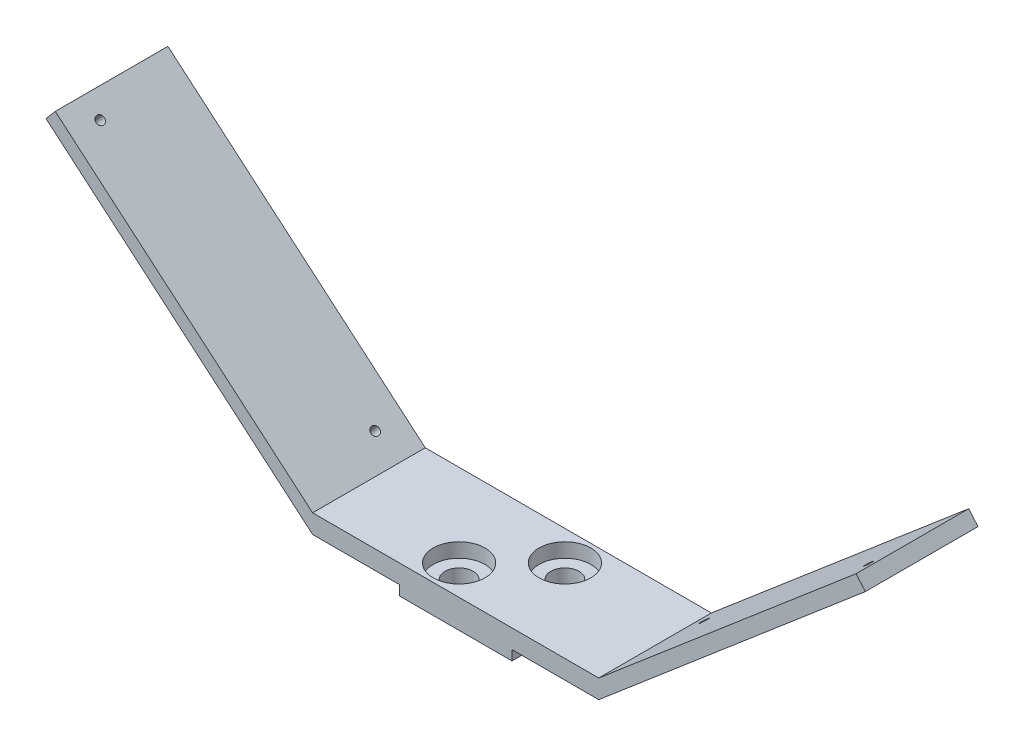
ISO-10303-21;
HEADER;
FILE_DESCRIPTION(('STEP AP214'),'2;1');
FILE_NAME('part.step','',(''),(''),'','','');
FILE_SCHEMA(('AUTOMOTIVE_DESIGN { 1 0 10303 214 1 1 1 1 }'));
ENDSEC;
DATA;
#1=APPLICATION_CONTEXT('core data for automotive mechanical design processes');
#2=APPLICATION_PROTOCOL_DEFINITION('international standard','automotive_design',2000,#1);
#3=PRODUCT_CONTEXT('',#1,'mechanical');
#4=PRODUCT('Part','Part','',(#3));
#5=PRODUCT_RELATED_PRODUCT_CATEGORY('part','',(#4));
#6=PRODUCT_DEFINITION_FORMATION('','',#4);
#7=PRODUCT_DEFINITION_CONTEXT('part definition',#1,'design');
#8=PRODUCT_DEFINITION('design','',#6,#7);
#9=PRODUCT_DEFINITION_SHAPE('','',#8);
#10=(LENGTH_UNIT() NAMED_UNIT(*) SI_UNIT(.MILLI.,.METRE.));
#11=(NAMED_UNIT(*) PLANE_ANGLE_UNIT() SI_UNIT($,.RADIAN.));
#12=(NAMED_UNIT(*) SI_UNIT($,.STERADIAN.) SOLID_ANGLE_UNIT());
#13=UNCERTAINTY_MEASURE_WITH_UNIT(LENGTH_MEASURE(1.E-05),#10,'distance_accuracy_value','');
#14=(GEOMETRIC_REPRESENTATION_CONTEXT(3) GLOBAL_UNCERTAINTY_ASSIGNED_CONTEXT((#13)) GLOBAL_UNIT_ASSIGNED_CONTEXT((#10,
#11,#12)) REPRESENTATION_CONTEXT('',''));
#15=CARTESIAN_POINT('',(0.,0.,0.));
#16=DIRECTION('',(0.,0.,1.));
#17=DIRECTION('',(1.,0.,0.));
#18=AXIS2_PLACEMENT_3D('',#15,#16,#17);
#19=CARTESIAN_POINT('',(10.,2.54,10.));
#20=DIRECTION('',(-1.,0.,0.));
#21=DIRECTION('',(0.,0.,1.));
#22=AXIS2_PLACEMENT_3D('',#19,#20,#21);
#23=PLANE('',#22);
#24=DIRECTION('',(0.,0.,1.));
#25=VECTOR('',#24,1.);
#26=CARTESIAN_POINT('',(10.,1.74482452369663,-85.6234074963013));
#27=LINE('',#26,#25);
#28=CARTESIAN_POINT('',(10.,1.74482452369663,-9.99999999999999));
#29=VERTEX_POINT('',#28);
#30=CARTESIAN_POINT('',(10.,1.74482452369663,10.));
#31=VERTEX_POINT('',#30);
#32=EDGE_CURVE('E209',#29,#31,#27,.T.);
#33=ORIENTED_EDGE('',*,*,#32,.T.);
#34=DIRECTION('',(0.,-1.,0.));
#35=VECTOR('',#34,1.);
#36=CARTESIAN_POINT('',(10.,2.54,10.));
#37=LINE('',#36,#35);
#38=CARTESIAN_POINT('',(10.,0.,10.));
#39=VERTEX_POINT('',#38);
#40=EDGE_CURVE('E53',#31,#39,#37,.T.);
#41=ORIENTED_EDGE('',*,*,#40,.T.);
#42=DIRECTION('',(0.,0.,-1.));
#43=VECTOR('',#42,1.);
#44=CARTESIAN_POINT('',(10.,0.,10.));
#45=LINE('',#44,#43);
#46=CARTESIAN_POINT('',(10.,0.,-9.99999999999999));
#47=VERTEX_POINT('',#46);
#48=EDGE_CURVE('E194',#39,#47,#45,.T.);
#49=ORIENTED_EDGE('',*,*,#48,.T.);
#50=DIRECTION('',(0.,-1.,0.));
#51=VECTOR('',#50,1.);
#52=CARTESIAN_POINT('',(10.,2.54,-9.99999999999999));
#53=LINE('',#52,#51);
#54=EDGE_CURVE('E202',#29,#47,#53,.T.);
#55=ORIENTED_EDGE('',*,*,#54,.F.);
#56=EDGE_LOOP('',(#33,#41,#49,#55));
#57=FACE_BOUND('',#56,.T.);
#58=ADVANCED_FACE('F45',(#57),#23,.F.);
#59=CARTESIAN_POINT('',(0.,2.54,0.));
#60=DIRECTION('',(0.,1.,0.));
#61=DIRECTION('',(0.,0.,1.));
#62=AXIS2_PLACEMENT_3D('',#59,#60,#61);
#63=PLANE('',#62);
#64=CARTESIAN_POINT('',(-4.6966991411009,2.54,4.69669914110091));
#65=DIRECTION('',(0.,1.,0.));
#66=DIRECTION('',(0.,0.,1.));
#67=AXIS2_PLACEMENT_3D('',#64,#65,#66);
#68=CIRCLE('',#67,2.5);
#69=CARTESIAN_POINT('',(-4.6966991411009,2.54,7.19669914110091));
#70=VERTEX_POINT('',#69);
#71=EDGE_CURVE('E178',#70,#70,#68,.T.);
#72=ORIENTED_EDGE('',*,*,#71,.F.);
#73=EDGE_LOOP('',(#72));
#74=FACE_BOUND('',#73,.T.);
#75=CARTESIAN_POINT('',(-4.6966991411009,2.54,4.69669914110091));
#76=DIRECTION('',(0.,1.,0.));
#77=DIRECTION('',(0.,0.,1.));
#78=AXIS2_PLACEMENT_3D('',#75,#76,#77);
#79=CIRCLE('',#78,4.6);
#80=CARTESIAN_POINT('',(-4.6966991411009,2.54,9.29669914110091));
#81=VERTEX_POINT('',#80);
#82=EDGE_CURVE('E172',#81,#81,#79,.T.);
#83=ORIENTED_EDGE('',*,*,#82,.T.);
#84=EDGE_LOOP('',(#83));
#85=FACE_BOUND('',#84,.T.);
#86=ADVANCED_FACE('F291',(#74,#85),#63,.T.);
#87=CARTESIAN_POINT('',(4.6966991411009,2.54,-4.69669914110089));
#88=DIRECTION('',(0.,1.,0.));
#89=DIRECTION('',(0.,0.,1.));
#90=AXIS2_PLACEMENT_3D('',#87,#88,#89);
#91=CIRCLE('',#90,2.5);
#92=CARTESIAN_POINT('',(4.6966991411009,2.54,-2.19669914110089));
#93=VERTEX_POINT('',#92);
#94=EDGE_CURVE('E184',#93,#93,#91,.T.);
#95=ORIENTED_EDGE('',*,*,#94,.F.);
#96=EDGE_LOOP('',(#95));
#97=FACE_BOUND('',#96,.T.);
#98=CARTESIAN_POINT('',(4.6966991411009,2.54,-4.69669914110089));
#99=DIRECTION('',(0.,1.,0.));
#100=DIRECTION('',(0.,0.,1.));
#101=AXIS2_PLACEMENT_3D('',#98,#99,#100);
#102=CIRCLE('',#101,4.6);
#103=CARTESIAN_POINT('',(4.6966991411009,2.54,-0.0966991411008901));
#104=VERTEX_POINT('',#103);
#105=EDGE_CURVE('E160',#104,#104,#102,.T.);
#106=ORIENTED_EDGE('',*,*,#105,.T.);
#107=EDGE_LOOP('',(#106));
#108=FACE_BOUND('',#107,.T.);
#109=ADVANCED_FACE('F298',(#97,#108),#63,.T.);
#110=CARTESIAN_POINT('',(0.,0.,0.));
#111=DIRECTION('',(0.,1.,0.));
#112=DIRECTION('',(0.,0.,1.));
#113=AXIS2_PLACEMENT_3D('',#110,#111,#112);
#114=PLANE('',#113);
#115=DIRECTION('',(0.,0.,1.));
#116=VECTOR('',#115,1.);
#117=CARTESIAN_POINT('',(-10.,0.,10.));
#118=LINE('',#117,#116);
#119=CARTESIAN_POINT('',(-10.,0.,-9.99999999999999));
#120=VERTEX_POINT('',#119);
#121=CARTESIAN_POINT('',(-10.,0.,10.));
#122=VERTEX_POINT('',#121);
#123=EDGE_CURVE('E187',#120,#122,#118,.T.);
#124=ORIENTED_EDGE('',*,*,#123,.F.);
#125=DIRECTION('',(-1.,0.,0.));
#126=VECTOR('',#125,1.);
#127=CARTESIAN_POINT('',(10.,0.,-9.99999999999999));
#128=LINE('',#127,#126);
#129=EDGE_CURVE('E197',#47,#120,#128,.T.);
#130=ORIENTED_EDGE('',*,*,#129,.F.);
#131=ORIENTED_EDGE('',*,*,#48,.F.);
#132=DIRECTION('',(1.,0.,0.));
#133=VECTOR('',#132,1.);
#134=CARTESIAN_POINT('',(10.,0.,10.));
#135=LINE('',#134,#133);
#136=EDGE_CURVE('E191',#122,#39,#135,.T.);
#137=ORIENTED_EDGE('',*,*,#136,.F.);
#138=EDGE_LOOP('',(#124,#130,#131,#137));
#139=FACE_BOUND('',#138,.T.);
#140=CARTESIAN_POINT('',(4.6966991411009,0.,-4.69669914110089));
#141=DIRECTION('',(0.,1.,0.));
#142=DIRECTION('',(0.,0.,1.));
#143=AXIS2_PLACEMENT_3D('',#140,#141,#142);
#144=CIRCLE('',#143,2.5);
#145=CARTESIAN_POINT('',(4.6966991411009,0.,-2.19669914110089));
#146=VERTEX_POINT('',#145);
#147=EDGE_CURVE('E181',#146,#146,#144,.T.);
#148=ORIENTED_EDGE('',*,*,#147,.T.);
#149=EDGE_LOOP('',(#148));
#150=FACE_BOUND('',#149,.T.);
#151=CARTESIAN_POINT('',(-4.6966991411009,0.,4.69669914110091));
#152=DIRECTION('',(0.,1.,0.));
#153=DIRECTION('',(0.,0.,1.));
#154=AXIS2_PLACEMENT_3D('',#151,#152,#153);
#155=CIRCLE('',#154,2.5);
#156=CARTESIAN_POINT('',(-4.6966991411009,0.,7.19669914110091));
#157=VERTEX_POINT('',#156);
#158=EDGE_CURVE('E171',#157,#157,#155,.T.);
#159=ORIENTED_EDGE('',*,*,#158,.T.);
#160=EDGE_LOOP('',(#159));
#161=FACE_BOUND('',#160,.T.);
#162=ADVANCED_FACE('F215',(#139,#150,#161),#114,.F.);
#163=CARTESIAN_POINT('',(-10.,2.54,10.));
#164=DIRECTION('',(1.,0.,0.));
#165=DIRECTION('',(0.,0.,-1.));
#166=AXIS2_PLACEMENT_3D('',#163,#164,#165);
#167=PLANE('',#166);
#168=DIRECTION('',(0.,-1.,0.));
#169=VECTOR('',#168,1.);
#170=CARTESIAN_POINT('',(-10.,2.54,10.));
#171=LINE('',#170,#169);
#172=CARTESIAN_POINT('',(-10.,1.74482452369663,10.));
#173=VERTEX_POINT('',#172);
#174=EDGE_CURVE('E11',#173,#122,#171,.T.);
#175=ORIENTED_EDGE('',*,*,#174,.F.);
#176=DIRECTION('',(0.,0.,1.));
#177=VECTOR('',#176,1.);
#178=CARTESIAN_POINT('',(-10.,1.74482452369663,-85.6234074963013));
#179=LINE('',#178,#177);
#180=CARTESIAN_POINT('',(-10.,1.74482452369663,-9.99999999999999));
#181=VERTEX_POINT('',#180);
#182=EDGE_CURVE('E62',#181,#173,#179,.T.);
#183=ORIENTED_EDGE('',*,*,#182,.F.);
#184=DIRECTION('',(0.,-1.,0.));
#185=VECTOR('',#184,1.);
#186=CARTESIAN_POINT('',(-10.,2.54,-9.99999999999999));
#187=LINE('',#186,#185);
#188=EDGE_CURVE('E200',#181,#120,#187,.T.);
#189=ORIENTED_EDGE('',*,*,#188,.T.);
#190=ORIENTED_EDGE('',*,*,#123,.T.);
#191=EDGE_LOOP('',(#175,#183,#189,#190));
#192=FACE_BOUND('',#191,.T.);
#193=ADVANCED_FACE('F47',(#192),#167,.F.);
#194=CARTESIAN_POINT('',(10.,2.54,10.));
#195=DIRECTION('',(0.,0.,-1.));
#196=DIRECTION('',(-1.,0.,0.));
#197=AXIS2_PLACEMENT_3D('',#194,#195,#196);
#198=PLANE('',#197);
#199=ORIENTED_EDGE('',*,*,#40,.F.);
#200=DIRECTION('',(-1.,0.,0.));
#201=VECTOR('',#200,1.);
#202=CARTESIAN_POINT('',(0.,1.74482452369662,10.));
#203=LINE('',#202,#201);
#204=CARTESIAN_POINT('',(25.4,1.74482452369663,10.));
#205=VERTEX_POINT('',#204);
#206=EDGE_CURVE('E152',#205,#31,#203,.T.);
#207=ORIENTED_EDGE('',*,*,#206,.F.);
#208=DIRECTION('',(-0.761579118714093,-0.648071945032854,0.));
#209=VECTOR('',#208,1.);
#210=CARTESIAN_POINT('',(9.8067578385574,-11.524371714243,10.));
#211=LINE('',#210,#209);
#212=CARTESIAN_POINT('',(72.740849863229,42.0299057404374,10.));
#213=VERTEX_POINT('',#212);
#214=EDGE_CURVE('E233',#213,#205,#211,.T.);
#215=ORIENTED_EDGE('',*,*,#214,.F.);
#216=DIRECTION('',(0.648071945032849,-0.761579118714097,0.));
#217=VECTOR('',#216,1.);
#218=CARTESIAN_POINT('',(62.934092024672,53.5542774546801,10.));
#219=LINE('',#218,#217);
#220=CARTESIAN_POINT('',(71.0947471228455,43.9643167019712,10.));
#221=VERTEX_POINT('',#220);
#222=EDGE_CURVE('E151',#221,#213,#219,.T.);
#223=ORIENTED_EDGE('',*,*,#222,.F.);
#224=DIRECTION('',(0.761579118714093,0.648071945032854,0.));
#225=VECTOR('',#224,1.);
#226=CARTESIAN_POINT('',(8.16065509817396,-9.58996075270922,10.));
#227=LINE('',#226,#225);
#228=CARTESIAN_POINT('',(25.4,5.08,10.));
#229=VERTEX_POINT('',#228);
#230=EDGE_CURVE('E134',#229,#221,#227,.T.);
#231=ORIENTED_EDGE('',*,*,#230,.F.);
#232=DIRECTION('',(-1.,0.,0.));
#233=VECTOR('',#232,1.);
#234=CARTESIAN_POINT('',(0.,5.08,9.99999999999999));
#235=LINE('',#234,#233);
#236=CARTESIAN_POINT('',(-25.4,5.08,9.99999999999999));
#237=VERTEX_POINT('',#236);
#238=EDGE_CURVE('E140',#229,#237,#235,.T.);
#239=ORIENTED_EDGE('',*,*,#238,.T.);
#240=DIRECTION('',(-0.761579118714092,0.648071945032854,0.));
#241=VECTOR('',#240,1.);
#242=CARTESIAN_POINT('',(-8.16065509817397,-9.58996075270922,10.));
#243=LINE('',#242,#241);
#244=CARTESIAN_POINT('',(-71.0947471228455,43.9643167019712,10.));
#245=VERTEX_POINT('',#244);
#246=EDGE_CURVE('E250',#237,#245,#243,.T.);
#247=ORIENTED_EDGE('',*,*,#246,.T.);
#248=DIRECTION('',(-0.648071945032864,-0.761579118714084,0.));
#249=VECTOR('',#248,1.);
#250=CARTESIAN_POINT('',(-62.9340920246708,53.5542774546811,10.));
#251=LINE('',#250,#249);
#252=CARTESIAN_POINT('',(-72.740849863229,42.0299057404374,10.));
#253=VERTEX_POINT('',#252);
#254=EDGE_CURVE('E252',#245,#253,#251,.T.);
#255=ORIENTED_EDGE('',*,*,#254,.T.);
#256=DIRECTION('',(0.761579118714093,-0.648071945032854,0.));
#257=VECTOR('',#256,1.);
#258=CARTESIAN_POINT('',(-9.8067578385574,-11.524371714243,10.));
#259=LINE('',#258,#257);
#260=CARTESIAN_POINT('',(-25.4,1.74482452369662,10.));
#261=VERTEX_POINT('',#260);
#262=EDGE_CURVE('E245',#253,#261,#259,.T.);
#263=ORIENTED_EDGE('',*,*,#262,.T.);
#264=DIRECTION('',(1.,0.,0.));
#265=VECTOR('',#264,1.);
#266=CARTESIAN_POINT('',(0.,1.74482452369662,10.));
#267=LINE('',#266,#265);
#268=EDGE_CURVE('E248',#261,#173,#267,.T.);
#269=ORIENTED_EDGE('',*,*,#268,.T.);
#270=ORIENTED_EDGE('',*,*,#174,.T.);
#271=ORIENTED_EDGE('',*,*,#136,.T.);
#272=EDGE_LOOP('',(#199,#207,#215,#223,#231,#239,#247,#255,#263,#269,#270,#271));
#273=FACE_BOUND('',#272,.T.);
#274=ADVANCED_FACE('F146',(#273),#198,.F.);
#275=CARTESIAN_POINT('',(10.,2.54,-9.99999999999999));
#276=DIRECTION('',(0.,0.,1.));
#277=DIRECTION('',(1.,0.,0.));
#278=AXIS2_PLACEMENT_3D('',#275,#276,#277);
#279=PLANE('',#278);
#280=DIRECTION('',(1.,0.,0.));
#281=VECTOR('',#280,1.);
#282=CARTESIAN_POINT('',(0.,1.74482452369662,-9.99999999999999));
#283=LINE('',#282,#281);
#284=CARTESIAN_POINT('',(25.4,1.74482452369663,-9.99999999999999));
#285=VERTEX_POINT('',#284);
#286=EDGE_CURVE('E221',#29,#285,#283,.T.);
#287=ORIENTED_EDGE('',*,*,#286,.F.);
#288=ORIENTED_EDGE('',*,*,#54,.T.);
#289=ORIENTED_EDGE('',*,*,#129,.T.);
#290=ORIENTED_EDGE('',*,*,#188,.F.);
#291=DIRECTION('',(-1.,0.,0.));
#292=VECTOR('',#291,1.);
#293=CARTESIAN_POINT('',(0.,1.74482452369662,-9.99999999999999));
#294=LINE('',#293,#292);
#295=CARTESIAN_POINT('',(-25.4,1.74482452369663,-9.99999999999999));
#296=VERTEX_POINT('',#295);
#297=EDGE_CURVE('E175',#181,#296,#294,.T.);
#298=ORIENTED_EDGE('',*,*,#297,.T.);
#299=DIRECTION('',(-0.761579118714093,0.648071945032854,0.));
#300=VECTOR('',#299,1.);
#301=CARTESIAN_POINT('',(-9.8067578385574,-11.524371714243,-9.99999999999999));
#302=LINE('',#301,#300);
#303=CARTESIAN_POINT('',(-72.740849863229,42.0299057404374,-9.99999999999999));
#304=VERTEX_POINT('',#303);
#305=EDGE_CURVE('E243',#296,#304,#302,.T.);
#306=ORIENTED_EDGE('',*,*,#305,.T.);
#307=DIRECTION('',(0.648071945032864,0.761579118714084,0.));
#308=VECTOR('',#307,1.);
#309=CARTESIAN_POINT('',(-62.9340920246708,53.5542774546811,-9.99999999999999));
#310=LINE('',#309,#308);
#311=CARTESIAN_POINT('',(-71.0947471228455,43.9643167019712,-9.99999999999999));
#312=VERTEX_POINT('',#311);
#313=EDGE_CURVE('E240',#304,#312,#310,.T.);
#314=ORIENTED_EDGE('',*,*,#313,.T.);
#315=DIRECTION('',(0.761579118714093,-0.648071945032854,0.));
#316=VECTOR('',#315,1.);
#317=CARTESIAN_POINT('',(-8.16065509817397,-9.58996075270922,-9.99999999999999));
#318=LINE('',#317,#316);
#319=CARTESIAN_POINT('',(-25.4,5.08,-9.99999999999999));
#320=VERTEX_POINT('',#319);
#321=EDGE_CURVE('E237',#312,#320,#318,.T.);
#322=ORIENTED_EDGE('',*,*,#321,.T.);
#323=DIRECTION('',(-1.,0.,0.));
#324=VECTOR('',#323,1.);
#325=CARTESIAN_POINT('',(0.,5.08,-9.99999999999999));
#326=LINE('',#325,#324);
#327=CARTESIAN_POINT('',(25.4,5.08,-9.99999999999999));
#328=VERTEX_POINT('',#327);
#329=EDGE_CURVE('E139',#328,#320,#326,.T.);
#330=ORIENTED_EDGE('',*,*,#329,.F.);
#331=DIRECTION('',(-0.761579118714093,-0.648071945032854,0.));
#332=VECTOR('',#331,1.);
#333=CARTESIAN_POINT('',(8.16065509817396,-9.58996075270922,-9.99999999999999));
#334=LINE('',#333,#332);
#335=CARTESIAN_POINT('',(71.0947471228455,43.9643167019712,-9.99999999999999));
#336=VERTEX_POINT('',#335);
#337=EDGE_CURVE('E135',#336,#328,#334,.T.);
#338=ORIENTED_EDGE('',*,*,#337,.F.);
#339=DIRECTION('',(-0.648071945032849,0.761579118714097,0.));
#340=VECTOR('',#339,1.);
#341=CARTESIAN_POINT('',(62.934092024672,53.5542774546801,-9.99999999999999));
#342=LINE('',#341,#340);
#343=CARTESIAN_POINT('',(72.740849863229,42.0299057404374,-9.99999999999999));
#344=VERTEX_POINT('',#343);
#345=EDGE_CURVE('E356',#344,#336,#342,.T.);
#346=ORIENTED_EDGE('',*,*,#345,.F.);
#347=DIRECTION('',(0.761579118714093,0.648071945032854,0.));
#348=VECTOR('',#347,1.);
#349=CARTESIAN_POINT('',(9.8067578385574,-11.524371714243,-9.99999999999999));
#350=LINE('',#349,#348);
#351=EDGE_CURVE('E223',#285,#344,#350,.T.);
#352=ORIENTED_EDGE('',*,*,#351,.F.);
#353=EDGE_LOOP('',(#287,#288,#289,#290,#298,#306,#314,#322,#330,#338,#346,#352));
#354=FACE_BOUND('',#353,.T.);
#355=ADVANCED_FACE('F218',(#354),#279,.F.);
#356=CARTESIAN_POINT('',(4.6966991411009,2.54,-4.69669914110089));
#357=DIRECTION('',(0.,-1.,0.));
#358=DIRECTION('',(0.,0.,-1.));
#359=AXIS2_PLACEMENT_3D('',#356,#357,#358);
#360=CYLINDRICAL_SURFACE('',#359,2.5);
#361=ORIENTED_EDGE('',*,*,#94,.T.);
#362=EDGE_LOOP('',(#361));
#363=FACE_BOUND('',#362,.T.);
#364=ORIENTED_EDGE('',*,*,#147,.F.);
#365=EDGE_LOOP('',(#364));
#366=FACE_BOUND('',#365,.T.);
#367=ADVANCED_FACE('F307',(#363,#366),#360,.F.);
#368=CARTESIAN_POINT('',(-4.6966991411009,2.54,4.69669914110091));
#369=DIRECTION('',(0.,-1.,0.));
#370=DIRECTION('',(0.,0.,-1.));
#371=AXIS2_PLACEMENT_3D('',#368,#369,#370);
#372=CYLINDRICAL_SURFACE('',#371,2.5);
#373=ORIENTED_EDGE('',*,*,#71,.T.);
#374=EDGE_LOOP('',(#373));
#375=FACE_BOUND('',#374,.T.);
#376=ORIENTED_EDGE('',*,*,#158,.F.);
#377=EDGE_LOOP('',(#376));
#378=FACE_BOUND('',#377,.T.);
#379=ADVANCED_FACE('F318',(#375,#378),#372,.F.);
#380=CARTESIAN_POINT('',(-4.6966991411009,5.08,4.69669914110091));
#381=DIRECTION('',(0.,-1.,0.));
#382=DIRECTION('',(0.,0.,-1.));
#383=AXIS2_PLACEMENT_3D('',#380,#381,#382);
#384=CYLINDRICAL_SURFACE('',#383,4.6);
#385=CARTESIAN_POINT('',(-4.6966991411009,5.08,4.69669914110091));
#386=DIRECTION('',(0.,1.,0.));
#387=DIRECTION('',(0.,0.,1.));
#388=AXIS2_PLACEMENT_3D('',#385,#386,#387);
#389=CIRCLE('',#388,4.6);
#390=CARTESIAN_POINT('',(-4.6966991411009,5.08,9.29669914110091));
#391=VERTEX_POINT('',#390);
#392=EDGE_CURVE('E165',#391,#391,#389,.T.);
#393=ORIENTED_EDGE('',*,*,#392,.T.);
#394=EDGE_LOOP('',(#393));
#395=FACE_BOUND('',#394,.T.);
#396=ORIENTED_EDGE('',*,*,#82,.F.);
#397=EDGE_LOOP('',(#396));
#398=FACE_BOUND('',#397,.T.);
#399=ADVANCED_FACE('F322',(#395,#398),#384,.F.);
#400=CARTESIAN_POINT('',(4.6966991411009,5.08,-4.69669914110089));
#401=DIRECTION('',(0.,-1.,0.));
#402=DIRECTION('',(0.,0.,-1.));
#403=AXIS2_PLACEMENT_3D('',#400,#401,#402);
#404=CYLINDRICAL_SURFACE('',#403,4.6);
#405=CARTESIAN_POINT('',(4.6966991411009,5.08,-4.69669914110089));
#406=DIRECTION('',(0.,1.,0.));
#407=DIRECTION('',(0.,0.,1.));
#408=AXIS2_PLACEMENT_3D('',#405,#406,#407);
#409=CIRCLE('',#408,4.6);
#410=CARTESIAN_POINT('',(4.6966991411009,5.08,-0.0966991411008901));
#411=VERTEX_POINT('',#410);
#412=EDGE_CURVE('E168',#411,#411,#409,.T.);
#413=ORIENTED_EDGE('',*,*,#412,.T.);
#414=EDGE_LOOP('',(#413));
#415=FACE_BOUND('',#414,.T.);
#416=ORIENTED_EDGE('',*,*,#105,.F.);
#417=EDGE_LOOP('',(#416));
#418=FACE_BOUND('',#417,.T.);
#419=ADVANCED_FACE('F326',(#415,#418),#404,.F.);
#420=CARTESIAN_POINT('',(0.,5.08,0.));
#421=DIRECTION('',(0.,1.,0.));
#422=DIRECTION('',(0.,0.,1.));
#423=AXIS2_PLACEMENT_3D('',#420,#421,#422);
#424=PLANE('',#423);
#425=DIRECTION('',(0.,0.,-1.));
#426=VECTOR('',#425,1.);
#427=CARTESIAN_POINT('',(-25.4,5.08,0.));
#428=LINE('',#427,#426);
#429=EDGE_CURVE('E158',#237,#320,#428,.T.);
#430=ORIENTED_EDGE('',*,*,#429,.F.);
#431=ORIENTED_EDGE('',*,*,#238,.F.);
#432=DIRECTION('',(0.,0.,-1.));
#433=VECTOR('',#432,1.);
#434=CARTESIAN_POINT('',(25.4,5.08,0.));
#435=LINE('',#434,#433);
#436=EDGE_CURVE('E130',#229,#328,#435,.T.);
#437=ORIENTED_EDGE('',*,*,#436,.T.);
#438=ORIENTED_EDGE('',*,*,#329,.T.);
#439=EDGE_LOOP('',(#430,#431,#437,#438));
#440=FACE_BOUND('',#439,.T.);
#441=ORIENTED_EDGE('',*,*,#392,.F.);
#442=EDGE_LOOP('',(#441));
#443=FACE_BOUND('',#442,.T.);
#444=ORIENTED_EDGE('',*,*,#412,.F.);
#445=EDGE_LOOP('',(#444));
#446=FACE_BOUND('',#445,.T.);
#447=ADVANCED_FACE('F155',(#440,#443,#446),#424,.T.);
#448=CARTESIAN_POINT('',(-9.8067578385574,-11.524371714243,-85.6234074963013));
#449=DIRECTION('',(-0.648071945032854,-0.761579118714093,0.));
#450=DIRECTION('',(0.761579118714093,-0.648071945032854,0.));
#451=AXIS2_PLACEMENT_3D('',#448,#449,#450);
#452=PLANE('',#451);
#453=CARTESIAN_POINT('',(-30.8539983339539,6.38594876363047,-4.90000000000001));
#454=DIRECTION('',(-0.648071945032854,-0.761579118714093,0.));
#455=DIRECTION('',(0.761579118714093,-0.648071945032854,0.));
#456=AXIS2_PLACEMENT_3D('',#453,#454,#455);
#457=CIRCLE('',#456,0.749999999999999);
#458=CARTESIAN_POINT('',(-30.2828139949183,5.89989480485583,-4.90000000000001));
#459=VERTEX_POINT('',#458);
#460=EDGE_CURVE('E153',#459,#459,#457,.F.);
#461=ORIENTED_EDGE('',*,*,#460,.T.);
#462=EDGE_LOOP('',(#461));
#463=FACE_BOUND('',#462,.T.);
#464=CARTESIAN_POINT('',(-69.8468492121154,39.5672323493126,4.90000000000001));
#465=DIRECTION('',(-0.648071945032854,-0.761579118714093,0.));
#466=DIRECTION('',(0.761579118714093,-0.648071945032854,0.));
#467=AXIS2_PLACEMENT_3D('',#464,#465,#466);
#468=CIRCLE('',#467,0.749999999999992);
#469=CARTESIAN_POINT('',(-69.2756648730799,39.0811783905379,4.90000000000001));
#470=VERTEX_POINT('',#469);
#471=EDGE_CURVE('E341',#470,#470,#468,.F.);
#472=ORIENTED_EDGE('',*,*,#471,.T.);
#473=EDGE_LOOP('',(#472));
#474=FACE_BOUND('',#473,.T.);
#475=ORIENTED_EDGE('',*,*,#305,.F.);
#476=DIRECTION('',(0.,0.,1.));
#477=VECTOR('',#476,1.);
#478=CARTESIAN_POINT('',(-25.4,1.74482452369662,-85.6234074963013));
#479=LINE('',#478,#477);
#480=EDGE_CURVE('E255',#296,#261,#479,.T.);
#481=ORIENTED_EDGE('',*,*,#480,.T.);
#482=ORIENTED_EDGE('',*,*,#262,.F.);
#483=DIRECTION('',(0.,0.,1.));
#484=VECTOR('',#483,1.);
#485=CARTESIAN_POINT('',(-72.740849863229,42.0299057404374,-85.6234074963013));
#486=LINE('',#485,#484);
#487=EDGE_CURVE('E241',#304,#253,#486,.T.);
#488=ORIENTED_EDGE('',*,*,#487,.F.);
#489=EDGE_LOOP('',(#475,#481,#482,#488));
#490=FACE_BOUND('',#489,.T.);
#491=ADVANCED_FACE('F266',(#463,#474,#490),#452,.T.);
#492=CARTESIAN_POINT('',(-62.9340920246708,53.5542774546811,-85.6234074963013));
#493=DIRECTION('',(-0.761579118714084,0.648071945032863,0.));
#494=DIRECTION('',(-0.648071945032864,-0.761579118714084,0.));
#495=AXIS2_PLACEMENT_3D('',#492,#493,#494);
#496=PLANE('',#495);
#497=ORIENTED_EDGE('',*,*,#313,.F.);
#498=ORIENTED_EDGE('',*,*,#487,.T.);
#499=ORIENTED_EDGE('',*,*,#254,.F.);
#500=DIRECTION('',(0.,0.,1.));
#501=VECTOR('',#500,1.);
#502=CARTESIAN_POINT('',(-71.0947471228455,43.9643167019712,-85.6234074963013));
#503=LINE('',#502,#501);
#504=EDGE_CURVE('E257',#312,#245,#503,.T.);
#505=ORIENTED_EDGE('',*,*,#504,.F.);
#506=EDGE_LOOP('',(#497,#498,#499,#505));
#507=FACE_BOUND('',#506,.T.);
#508=ADVANCED_FACE('F273',(#507),#496,.T.);
#509=CARTESIAN_POINT('',(-8.16065509817397,-9.58996075270922,-85.6234074963013));
#510=DIRECTION('',(0.648071945032854,0.761579118714092,0.));
#511=DIRECTION('',(-0.761579118714093,0.648071945032854,0.));
#512=AXIS2_PLACEMENT_3D('',#509,#510,#511);
#513=PLANE('',#512);
#514=CARTESIAN_POINT('',(-29.2078955935705,8.32035972516425,-4.90000000000001));
#515=DIRECTION('',(0.648071945032854,0.761579118714093,0.));
#516=DIRECTION('',(-0.761579118714093,0.648071945032854,0.));
#517=AXIS2_PLACEMENT_3D('',#514,#515,#516);
#518=CIRCLE('',#517,0.749999999999999);
#519=CARTESIAN_POINT('',(-29.779079932606,8.80641368393889,-4.90000000000001));
#520=VERTEX_POINT('',#519);
#521=EDGE_CURVE('E347',#520,#520,#518,.T.);
#522=ORIENTED_EDGE('',*,*,#521,.F.);
#523=EDGE_LOOP('',(#522));
#524=FACE_BOUND('',#523,.T.);
#525=CARTESIAN_POINT('',(-68.200746471732,41.5016433108464,4.90000000000001));
#526=DIRECTION('',(0.648071945032854,0.761579118714093,0.));
#527=DIRECTION('',(-0.761579118714093,0.648071945032854,0.));
#528=AXIS2_PLACEMENT_3D('',#525,#526,#527);
#529=CIRCLE('',#528,0.749999999999992);
#530=CARTESIAN_POINT('',(-68.7719308107676,41.987697269621,4.90000000000001));
#531=VERTEX_POINT('',#530);
#532=EDGE_CURVE('E343',#531,#531,#529,.T.);
#533=ORIENTED_EDGE('',*,*,#532,.F.);
#534=EDGE_LOOP('',(#533));
#535=FACE_BOUND('',#534,.T.);
#536=ORIENTED_EDGE('',*,*,#321,.F.);
#537=ORIENTED_EDGE('',*,*,#504,.T.);
#538=ORIENTED_EDGE('',*,*,#246,.F.);
#539=ORIENTED_EDGE('',*,*,#429,.T.);
#540=EDGE_LOOP('',(#536,#537,#538,#539));
#541=FACE_BOUND('',#540,.T.);
#542=ADVANCED_FACE('F276',(#524,#535,#541),#513,.T.);
#543=CARTESIAN_POINT('',(0.,1.74482452369662,-85.6234074963013));
#544=DIRECTION('',(0.,-1.,0.));
#545=DIRECTION('',(1.,0.,0.));
#546=AXIS2_PLACEMENT_3D('',#543,#544,#545);
#547=PLANE('',#546);
#548=ORIENTED_EDGE('',*,*,#297,.F.);
#549=ORIENTED_EDGE('',*,*,#182,.T.);
#550=ORIENTED_EDGE('',*,*,#268,.F.);
#551=ORIENTED_EDGE('',*,*,#480,.F.);
#552=EDGE_LOOP('',(#548,#549,#550,#551));
#553=FACE_BOUND('',#552,.T.);
#554=ADVANCED_FACE('F269',(#553),#547,.T.);
#555=CARTESIAN_POINT('',(0.,1.74482452369662,-85.6234074963013));
#556=DIRECTION('',(0.,1.,0.));
#557=DIRECTION('',(-1.,0.,0.));
#558=AXIS2_PLACEMENT_3D('',#555,#556,#557);
#559=PLANE('',#558);
#560=ORIENTED_EDGE('',*,*,#32,.F.);
#561=ORIENTED_EDGE('',*,*,#286,.T.);
#562=DIRECTION('',(0.,0.,1.));
#563=VECTOR('',#562,1.);
#564=CARTESIAN_POINT('',(25.4,1.74482452369663,-85.6234074963013));
#565=LINE('',#564,#563);
#566=EDGE_CURVE('E229',#285,#205,#565,.T.);
#567=ORIENTED_EDGE('',*,*,#566,.T.);
#568=ORIENTED_EDGE('',*,*,#206,.T.);
#569=EDGE_LOOP('',(#560,#561,#567,#568));
#570=FACE_BOUND('',#569,.T.);
#571=ADVANCED_FACE('F228',(#570),#559,.F.);
#572=CARTESIAN_POINT('',(9.8067578385574,-11.524371714243,-85.6234074963013));
#573=DIRECTION('',(-0.648071945032854,0.761579118714093,0.));
#574=DIRECTION('',(-0.761579118714093,-0.648071945032854,0.));
#575=AXIS2_PLACEMENT_3D('',#572,#573,#574);
#576=PLANE('',#575);
#577=CARTESIAN_POINT('',(30.8539983339539,6.38594876363052,-4.90000000000001));
#578=DIRECTION('',(-0.648071945032854,0.761579118714093,0.));
#579=DIRECTION('',(-0.761579118714093,-0.648071945032854,0.));
#580=AXIS2_PLACEMENT_3D('',#577,#578,#579);
#581=CIRCLE('',#580,0.749999999999999);
#582=CARTESIAN_POINT('',(30.2828139949183,5.89989480485588,-4.90000000000001));
#583=VERTEX_POINT('',#582);
#584=EDGE_CURVE('E344',#583,#583,#581,.F.);
#585=ORIENTED_EDGE('',*,*,#584,.F.);
#586=EDGE_LOOP('',(#585));
#587=FACE_BOUND('',#586,.T.);
#588=CARTESIAN_POINT('',(69.8468492121154,39.5672323493126,4.90000000000001));
#589=DIRECTION('',(-0.648071945032854,0.761579118714093,0.));
#590=DIRECTION('',(-0.761579118714093,-0.648071945032854,0.));
#591=AXIS2_PLACEMENT_3D('',#588,#589,#590);
#592=CIRCLE('',#591,0.749999999999992);
#593=CARTESIAN_POINT('',(69.2756648730799,39.081178390538,4.90000000000001));
#594=VERTEX_POINT('',#593);
#595=EDGE_CURVE('E350',#594,#594,#592,.F.);
#596=ORIENTED_EDGE('',*,*,#595,.F.);
#597=EDGE_LOOP('',(#596));
#598=FACE_BOUND('',#597,.T.);
#599=ORIENTED_EDGE('',*,*,#566,.F.);
#600=ORIENTED_EDGE('',*,*,#351,.T.);
#601=DIRECTION('',(0.,0.,1.));
#602=VECTOR('',#601,1.);
#603=CARTESIAN_POINT('',(72.740849863229,42.0299057404374,-85.6234074963013));
#604=LINE('',#603,#602);
#605=EDGE_CURVE('E231',#344,#213,#604,.T.);
#606=ORIENTED_EDGE('',*,*,#605,.T.);
#607=ORIENTED_EDGE('',*,*,#214,.T.);
#608=EDGE_LOOP('',(#599,#600,#606,#607));
#609=FACE_BOUND('',#608,.T.);
#610=ADVANCED_FACE('F365',(#587,#598,#609),#576,.F.);
#611=CARTESIAN_POINT('',(62.934092024672,53.5542774546801,-85.6234074963013));
#612=DIRECTION('',(-0.761579118714097,-0.648071945032848,0.));
#613=DIRECTION('',(0.648071945032849,-0.761579118714097,0.));
#614=AXIS2_PLACEMENT_3D('',#611,#612,#613);
#615=PLANE('',#614);
#616=ORIENTED_EDGE('',*,*,#605,.F.);
#617=ORIENTED_EDGE('',*,*,#345,.T.);
#618=DIRECTION('',(0.,0.,1.));
#619=VECTOR('',#618,1.);
#620=CARTESIAN_POINT('',(71.0947471228455,43.9643167019712,-85.6234074963013));
#621=LINE('',#620,#619);
#622=EDGE_CURVE('E226',#336,#221,#621,.T.);
#623=ORIENTED_EDGE('',*,*,#622,.T.);
#624=ORIENTED_EDGE('',*,*,#222,.T.);
#625=EDGE_LOOP('',(#616,#617,#623,#624));
#626=FACE_BOUND('',#625,.T.);
#627=ADVANCED_FACE('F367',(#626),#615,.F.);
#628=CARTESIAN_POINT('',(8.16065509817396,-9.58996075270922,-85.6234074963013));
#629=DIRECTION('',(0.648071945032854,-0.761579118714093,0.));
#630=DIRECTION('',(0.761579118714093,0.648071945032854,0.));
#631=AXIS2_PLACEMENT_3D('',#628,#629,#630);
#632=PLANE('',#631);
#633=CARTESIAN_POINT('',(29.2078955935705,8.32035972516425,-4.90000000000001));
#634=DIRECTION('',(0.648071945032854,-0.761579118714093,0.));
#635=DIRECTION('',(0.761579118714093,0.648071945032854,0.));
#636=AXIS2_PLACEMENT_3D('',#633,#634,#635);
#637=CIRCLE('',#636,0.749999999999999);
#638=CARTESIAN_POINT('',(29.779079932606,8.80641368393889,-4.90000000000001));
#639=VERTEX_POINT('',#638);
#640=EDGE_CURVE('E479',#639,#639,#637,.T.);
#641=ORIENTED_EDGE('',*,*,#640,.T.);
#642=EDGE_LOOP('',(#641));
#643=FACE_BOUND('',#642,.T.);
#644=CARTESIAN_POINT('',(68.200746471732,41.5016433108464,4.90000000000001));
#645=DIRECTION('',(0.648071945032854,-0.761579118714093,0.));
#646=DIRECTION('',(0.761579118714093,0.648071945032854,0.));
#647=AXIS2_PLACEMENT_3D('',#644,#645,#646);
#648=CIRCLE('',#647,0.749999999999992);
#649=CARTESIAN_POINT('',(68.7719308107676,41.987697269621,4.90000000000001));
#650=VERTEX_POINT('',#649);
#651=EDGE_CURVE('E486',#650,#650,#648,.T.);
#652=ORIENTED_EDGE('',*,*,#651,.T.);
#653=EDGE_LOOP('',(#652));
#654=FACE_BOUND('',#653,.T.);
#655=ORIENTED_EDGE('',*,*,#622,.F.);
#656=ORIENTED_EDGE('',*,*,#337,.T.);
#657=ORIENTED_EDGE('',*,*,#436,.F.);
#658=ORIENTED_EDGE('',*,*,#230,.T.);
#659=EDGE_LOOP('',(#655,#656,#657,#658));
#660=FACE_BOUND('',#659,.T.);
#661=ADVANCED_FACE('F133',(#643,#654,#660),#632,.F.);
#662=CARTESIAN_POINT('',(-71.2216174132039,37.9516790715542,4.90000000000001));
#663=DIRECTION('',(0.648071945032854,0.761579118714093,0.));
#664=DIRECTION('',(-0.761579118714093,0.648071945032854,0.));
#665=AXIS2_PLACEMENT_3D('',#662,#663,#664);
#666=CYLINDRICAL_SURFACE('',#665,0.749999999999992);
#667=ORIENTED_EDGE('',*,*,#532,.T.);
#668=EDGE_LOOP('',(#667));
#669=FACE_BOUND('',#668,.T.);
#670=ORIENTED_EDGE('',*,*,#471,.F.);
#671=EDGE_LOOP('',(#670));
#672=FACE_BOUND('',#671,.T.);
#673=ADVANCED_FACE('F373',(#669,#672),#666,.F.);
#674=CARTESIAN_POINT('',(-32.2287665350423,4.77039548587204,-4.90000000000001));
#675=DIRECTION('',(0.648071945032854,0.761579118714093,0.));
#676=DIRECTION('',(-0.761579118714093,0.648071945032854,0.));
#677=AXIS2_PLACEMENT_3D('',#674,#675,#676);
#678=CYLINDRICAL_SURFACE('',#677,0.749999999999999);
#679=ORIENTED_EDGE('',*,*,#521,.T.);
#680=EDGE_LOOP('',(#679));
#681=FACE_BOUND('',#680,.T.);
#682=ORIENTED_EDGE('',*,*,#460,.F.);
#683=EDGE_LOOP('',(#682));
#684=FACE_BOUND('',#683,.T.);
#685=ADVANCED_FACE('F442',(#681,#684),#678,.F.);
#686=CARTESIAN_POINT('',(441.511166607986,-397.192583392245,4.90000000000001));
#687=DIRECTION('',(-0.648071945032854,0.761579118714093,0.));
#688=DIRECTION('',(-0.761579118714093,-0.648071945032854,0.));
#689=AXIS2_PLACEMENT_3D('',#686,#687,#688);
#690=CYLINDRICAL_SURFACE('',#689,0.749999999999992);
#691=ORIENTED_EDGE('',*,*,#651,.F.);
#692=EDGE_LOOP('',(#691));
#693=FACE_BOUND('',#692,.T.);
#694=ORIENTED_EDGE('',*,*,#595,.T.);
#695=EDGE_LOOP('',(#694));
#696=FACE_BOUND('',#695,.T.);
#697=ADVANCED_FACE('F450',(#693,#696),#690,.F.);
#698=CARTESIAN_POINT('',(402.518315729825,-430.373866977927,-4.90000000000001));
#699=DIRECTION('',(-0.648071945032854,0.761579118714093,0.));
#700=DIRECTION('',(-0.761579118714093,-0.648071945032854,0.));
#701=AXIS2_PLACEMENT_3D('',#698,#699,#700);
#702=CYLINDRICAL_SURFACE('',#701,0.749999999999999);
#703=ORIENTED_EDGE('',*,*,#640,.F.);
#704=EDGE_LOOP('',(#703));
#705=FACE_BOUND('',#704,.T.);
#706=ORIENTED_EDGE('',*,*,#584,.T.);
#707=EDGE_LOOP('',(#706));
#708=FACE_BOUND('',#707,.T.);
#709=ADVANCED_FACE('F458',(#705,#708),#702,.F.);
#710=CLOSED_SHELL('',(#58,#86,#109,#162,#193,#274,#355,#367,#379,#399,#419,#447,#491,#508,#542,
#554,#571,#610,#627,#661,#673,#685,#697,#709));
#711=MANIFOLD_SOLID_BREP('B2',#710);
#712=ADVANCED_BREP_SHAPE_REPRESENTATION('',(#18,#711),#14);
#713=SHAPE_DEFINITION_REPRESENTATION(#9,#712);
ENDSEC;
END-ISO-10303-21;
